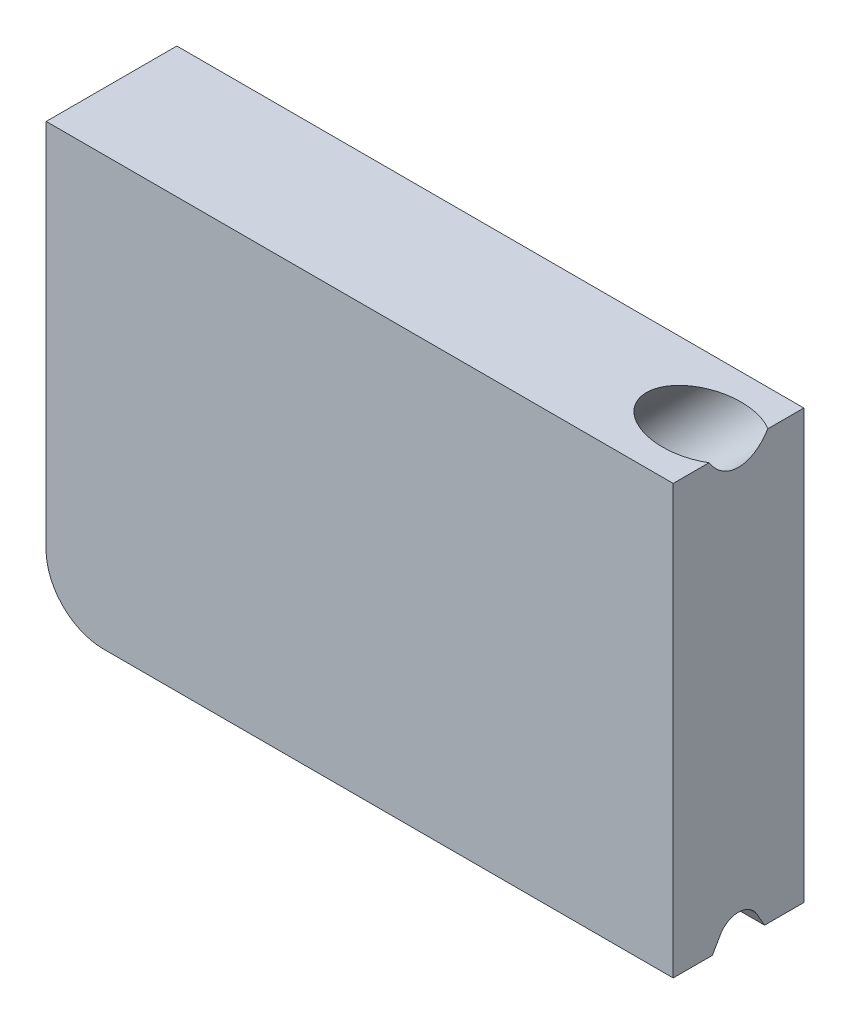
ISO-10303-21;
HEADER;
FILE_DESCRIPTION(('STEP AP214'),'2;1');
FILE_NAME('part.step','',(''),(''),'','','');
FILE_SCHEMA(('AUTOMOTIVE_DESIGN { 1 0 10303 214 1 1 1 1 }'));
ENDSEC;
DATA;
#1=APPLICATION_CONTEXT('core data for automotive mechanical design processes');
#2=APPLICATION_PROTOCOL_DEFINITION('international standard','automotive_design',2000,#1);
#3=PRODUCT_CONTEXT('',#1,'mechanical');
#4=PRODUCT('Part','Part','',(#3));
#5=PRODUCT_RELATED_PRODUCT_CATEGORY('part','',(#4));
#6=PRODUCT_DEFINITION_FORMATION('','',#4);
#7=PRODUCT_DEFINITION_CONTEXT('part definition',#1,'design');
#8=PRODUCT_DEFINITION('design','',#6,#7);
#9=PRODUCT_DEFINITION_SHAPE('','',#8);
#10=(LENGTH_UNIT() NAMED_UNIT(*) SI_UNIT(.MILLI.,.METRE.));
#11=(NAMED_UNIT(*) PLANE_ANGLE_UNIT() SI_UNIT($,.RADIAN.));
#12=(NAMED_UNIT(*) SI_UNIT($,.STERADIAN.) SOLID_ANGLE_UNIT());
#13=UNCERTAINTY_MEASURE_WITH_UNIT(LENGTH_MEASURE(1.E-05),#10,'distance_accuracy_value','');
#14=(GEOMETRIC_REPRESENTATION_CONTEXT(3) GLOBAL_UNCERTAINTY_ASSIGNED_CONTEXT((#13)) GLOBAL_UNIT_ASSIGNED_CONTEXT((#10,
#11,#12)) REPRESENTATION_CONTEXT('',''));
#15=CARTESIAN_POINT('',(0.,0.,0.));
#16=DIRECTION('',(0.,0.,1.));
#17=DIRECTION('',(1.,0.,0.));
#18=AXIS2_PLACEMENT_3D('',#15,#16,#17);
#19=CARTESIAN_POINT('',(37.8727893023531,0.,-0.0635));
#20=DIRECTION('',(0.,0.,-1.));
#21=DIRECTION('',(-1.,0.,0.));
#22=AXIS2_PLACEMENT_3D('',#19,#20,#21);
#23=PLANE('',#22);
#24=DIRECTION('',(0.,-1.,0.));
#25=VECTOR('',#24,1.);
#26=CARTESIAN_POINT('',(-0.37592,29.999999944,-0.0635));
#27=LINE('',#26,#25);
#28=CARTESIAN_POINT('',(-0.37592,0.416450285248574,-0.0635));
#29=VERTEX_POINT('',#28);
#30=CARTESIAN_POINT('',(-0.37592,0.0525118412388941,-0.0635000000000011));
#31=VERTEX_POINT('',#30);
#32=EDGE_CURVE('E55',#29,#31,#27,.T.);
#33=ORIENTED_EDGE('',*,*,#32,.F.);
#34=DIRECTION('',(1.,0.,0.));
#35=VECTOR('',#34,1.);
#36=CARTESIAN_POINT('',(37.8727893023531,0.416450285248574,-0.0635));
#37=LINE('',#36,#35);
#38=CARTESIAN_POINT('',(0.23368,0.416450285248574,-0.0635000000000011));
#39=VERTEX_POINT('',#38);
#40=EDGE_CURVE('E210',#29,#39,#37,.T.);
#41=ORIENTED_EDGE('',*,*,#40,.T.);
#42=DIRECTION('',(0.,-1.,0.));
#43=VECTOR('',#42,1.);
#44=CARTESIAN_POINT('',(0.23368,0.,-0.0635000000000011));
#45=LINE('',#44,#43);
#46=CARTESIAN_POINT('',(0.23368,0.,-0.0635));
#47=VERTEX_POINT('',#46);
#48=EDGE_CURVE('E196',#39,#47,#45,.T.);
#49=ORIENTED_EDGE('',*,*,#48,.T.);
#50=DIRECTION('',(-1.,0.,0.));
#51=VECTOR('',#50,1.);
#52=CARTESIAN_POINT('',(37.8727893023531,0.,-0.0635));
#53=LINE('',#52,#51);
#54=CARTESIAN_POINT('',(-0.3201416,0.,-0.0635000000000011));
#55=VERTEX_POINT('',#54);
#56=EDGE_CURVE('E338',#47,#55,#53,.T.);
#57=ORIENTED_EDGE('',*,*,#56,.T.);
#58=CARTESIAN_POINT('',(-0.3201416,0.05588,-0.0635000000000011));
#59=DIRECTION('',(0.,0.,-1.));
#60=DIRECTION('',(-1.,0.,0.));
#61=AXIS2_PLACEMENT_3D('',#58,#59,#60);
#62=CIRCLE('',#61,0.05588);
#63=EDGE_CURVE('E459',#31,#55,#62,.F.);
#64=ORIENTED_EDGE('',*,*,#63,.F.);
#65=EDGE_LOOP('',(#33,#41,#49,#57,#64));
#66=FACE_BOUND('',#65,.T.);
#67=ADVANCED_FACE('F47',(#66),#23,.T.);
#68=CARTESIAN_POINT('',(37.8727893023531,0.,0.0635));
#69=DIRECTION('',(0.,0.,1.));
#70=DIRECTION('',(1.,0.,0.));
#71=AXIS2_PLACEMENT_3D('',#68,#69,#70);
#72=PLANE('',#71);
#73=DIRECTION('',(0.,1.,0.));
#74=VECTOR('',#73,1.);
#75=CARTESIAN_POINT('',(0.23368,0.,0.0635000000000011));
#76=LINE('',#75,#74);
#77=CARTESIAN_POINT('',(0.23368,0.,0.0635));
#78=VERTEX_POINT('',#77);
#79=CARTESIAN_POINT('',(0.23368,0.416450285248574,0.0635000000000011));
#80=VERTEX_POINT('',#79);
#81=EDGE_CURVE('E330',#78,#80,#76,.T.);
#82=ORIENTED_EDGE('',*,*,#81,.T.);
#83=DIRECTION('',(-1.,0.,0.));
#84=VECTOR('',#83,1.);
#85=CARTESIAN_POINT('',(37.8727893023531,0.416450285248574,0.0635));
#86=LINE('',#85,#84);
#87=CARTESIAN_POINT('',(-0.37592,0.416450285248574,0.0635));
#88=VERTEX_POINT('',#87);
#89=EDGE_CURVE('E76',#80,#88,#86,.T.);
#90=ORIENTED_EDGE('',*,*,#89,.T.);
#91=DIRECTION('',(0.,1.,0.));
#92=VECTOR('',#91,1.);
#93=CARTESIAN_POINT('',(-0.37592,29.999999944,0.0635));
#94=LINE('',#93,#92);
#95=CARTESIAN_POINT('',(-0.37592,0.0525118412388941,0.0635000000000011));
#96=VERTEX_POINT('',#95);
#97=EDGE_CURVE('E332',#96,#88,#94,.T.);
#98=ORIENTED_EDGE('',*,*,#97,.F.);
#99=CARTESIAN_POINT('',(-0.3201416,0.05588,0.0635000000000011));
#100=DIRECTION('',(0.,0.,1.));
#101=DIRECTION('',(1.,0.,0.));
#102=AXIS2_PLACEMENT_3D('',#99,#100,#101);
#103=CIRCLE('',#102,0.05588);
#104=CARTESIAN_POINT('',(-0.3201416,0.,0.0635000000000011));
#105=VERTEX_POINT('',#104);
#106=EDGE_CURVE('E446',#105,#96,#103,.F.);
#107=ORIENTED_EDGE('',*,*,#106,.F.);
#108=DIRECTION('',(-1.,0.,0.));
#109=VECTOR('',#108,1.);
#110=CARTESIAN_POINT('',(37.8727893023531,0.,0.0635));
#111=LINE('',#110,#109);
#112=EDGE_CURVE('E335',#78,#105,#111,.T.);
#113=ORIENTED_EDGE('',*,*,#112,.F.);
#114=EDGE_LOOP('',(#82,#90,#98,#107,#113));
#115=FACE_BOUND('',#114,.T.);
#116=ADVANCED_FACE('F389',(#115),#72,.T.);
#117=CARTESIAN_POINT('',(-0.37592,29.999999944,-0.80247998));
#118=DIRECTION('',(-1.,0.,0.));
#119=DIRECTION('',(0.,0.,1.));
#120=AXIS2_PLACEMENT_3D('',#117,#118,#119);
#121=PLANE('',#120);
#122=ORIENTED_EDGE('',*,*,#97,.T.);
#123=DIRECTION('',(0.,0.,-1.));
#124=VECTOR('',#123,1.);
#125=CARTESIAN_POINT('',(-0.37592,0.416450285248574,-0.80247998));
#126=LINE('',#125,#124);
#127=EDGE_CURVE('E68',#88,#29,#126,.T.);
#128=ORIENTED_EDGE('',*,*,#127,.T.);
#129=ORIENTED_EDGE('',*,*,#32,.T.);
#130=DIRECTION('',(0.,0.,-1.));
#131=VECTOR('',#130,1.);
#132=CARTESIAN_POINT('',(-0.37592,0.0525118412388941,37.6127138980092));
#133=LINE('',#132,#131);
#134=CARTESIAN_POINT('',(-0.37592,0.0525250403824918,-0.0272323203714327));
#135=VERTEX_POINT('',#134);
#136=EDGE_CURVE('E454',#135,#31,#133,.T.);
#137=ORIENTED_EDGE('',*,*,#136,.F.);
#138=CARTESIAN_POINT('',(-0.37592,0.0135140905122495,0.0175976362048998));
#139=CARTESIAN_POINT('',(-0.37592,0.0229198321940677,0.0268164528061493));
#140=CARTESIAN_POINT('',(-0.375919999999999,0.0383728920909442,0.0311593514217872));
#141=CARTESIAN_POINT('',(-0.375920000000001,0.0640224357976938,0.024085648578213));
#142=CARTESIAN_POINT('',(-0.37592,0.0744740905122485,0.0121167298490642));
#143=CARTESIAN_POINT('',(-0.37592,0.0744740905122485,-0.012116729849064));
#144=CARTESIAN_POINT('',(-0.375919999999999,0.0640224357976993,-0.0240856485782128));
#145=CARTESIAN_POINT('',(-0.37592,0.0383728920909457,-0.0311593514217872));
#146=CARTESIAN_POINT('',(-0.37592,0.0229198321940666,-0.0268164528061483));
#147=CARTESIAN_POINT('',(-0.37592,0.0135140905122495,-0.0175976362048998));
#148=(BOUNDED_CURVE() B_SPLINE_CURVE(3,(#138,#139,#140,#141,#142,#143,#144,#145,#146,#147),
.UNSPECIFIED.,.F.,.F.) B_SPLINE_CURVE_WITH_KNOTS((4,2,2,2,4),(3.66519142918809,4.18879020478639,
4.71238898038469,5.23598775598299,5.75958653158129),
.UNSPECIFIED.) CURVE() GEOMETRIC_REPRESENTATION_ITEM() RATIONAL_B_SPLINE_CURVE((1.,1.,1.,1.,1.,
1.,1.,1.,1.,1.)) REPRESENTATION_ITEM(''));
#149=CARTESIAN_POINT('',(-0.375920000000275,0.0525255387834095,0.0272159605744741));
#150=VERTEX_POINT('',#149);
#151=EDGE_CURVE('E420',#135,#150,#148,.F.);
#152=ORIENTED_EDGE('',*,*,#151,.T.);
#153=EDGE_CURVE('E445',#96,#150,#133,.T.);
#154=ORIENTED_EDGE('',*,*,#153,.F.);
#155=EDGE_LOOP('',(#122,#128,#129,#137,#152,#154));
#156=FACE_BOUND('',#155,.T.);
#157=ADVANCED_FACE('F392',(#156),#121,.T.);
#158=CARTESIAN_POINT('',(0.23368,0.,38.4527456938784));
#159=DIRECTION('',(-1.,0.,0.));
#160=DIRECTION('',(0.,0.,1.));
#161=AXIS2_PLACEMENT_3D('',#158,#159,#160);
#162=PLANE('',#161);
#163=DIRECTION('',(0.,0.,-1.));
#164=VECTOR('',#163,1.);
#165=CARTESIAN_POINT('',(0.23368,0.416450285248574,38.4527456938784));
#166=LINE('',#165,#164);
#167=CARTESIAN_POINT('',(0.23368,0.416450285248574,0.0285560103091458));
#168=VERTEX_POINT('',#167);
#169=EDGE_CURVE('E206',#80,#168,#166,.T.);
#170=ORIENTED_EDGE('',*,*,#169,.F.);
#171=ORIENTED_EDGE('',*,*,#81,.F.);
#172=DIRECTION('',(0.,0.,-1.));
#173=VECTOR('',#172,1.);
#174=CARTESIAN_POINT('',(0.23368,0.,38.4527456938784));
#175=LINE('',#174,#173);
#176=CARTESIAN_POINT('',(0.23368,0.,0.0254));
#177=VERTEX_POINT('',#176);
#178=EDGE_CURVE('E348',#78,#177,#175,.T.);
#179=ORIENTED_EDGE('',*,*,#178,.T.);
#180=DIRECTION('',(0.,0.86602540378444,-0.499999999999998));
#181=VECTOR('',#180,1.);
#182=CARTESIAN_POINT('',(0.23368,-16.6395287854526,9.63223642346953));
#183=LINE('',#182,#181);
#184=CARTESIAN_POINT('',(0.23368,0.0135140905122495,0.0175976362048998));
#185=VERTEX_POINT('',#184);
#186=EDGE_CURVE('E287',#177,#185,#183,.T.);
#187=ORIENTED_EDGE('',*,*,#186,.T.);
#188=CARTESIAN_POINT('',(0.23368,0.00335409051224956,0.));
#189=DIRECTION('',(-1.,0.,0.));
#190=DIRECTION('',(0.,0.,1.));
#191=AXIS2_PLACEMENT_3D('',#188,#189,#190);
#192=CIRCLE('',#191,0.02032);
#193=CARTESIAN_POINT('',(0.23368,0.0135140905122495,-0.0175976362048998));
#194=VERTEX_POINT('',#193);
#195=EDGE_CURVE('E282',#185,#194,#192,.T.);
#196=ORIENTED_EDGE('',*,*,#195,.T.);
#197=DIRECTION('',(0.,-0.86602540378444,-0.499999999999998));
#198=VECTOR('',#197,1.);
#199=CARTESIAN_POINT('',(0.23368,16.6615258307087,9.59413642346951));
#200=LINE('',#199,#198);
#201=CARTESIAN_POINT('',(0.23368,0.,-0.0254));
#202=VERTEX_POINT('',#201);
#203=EDGE_CURVE('E279',#194,#202,#200,.T.);
#204=ORIENTED_EDGE('',*,*,#203,.T.);
#205=EDGE_CURVE('E343',#202,#47,#175,.T.);
#206=ORIENTED_EDGE('',*,*,#205,.T.);
#207=ORIENTED_EDGE('',*,*,#48,.F.);
#208=CARTESIAN_POINT('',(0.23368,0.416450285248574,-0.0285560103091458));
#209=VERTEX_POINT('',#208);
#210=EDGE_CURVE('E201',#209,#39,#166,.T.);
#211=ORIENTED_EDGE('',*,*,#210,.F.);
#212=CARTESIAN_POINT('',(0.23368,0.452119999999997,0.));
#213=DIRECTION('',(-1.,0.,0.));
#214=DIRECTION('',(0.,1.,0.));
#215=AXIS2_PLACEMENT_3D('',#212,#213,#214);
#216=ELLIPSE('',#215,0.0538815367264146,0.0381);
#217=EDGE_CURVE('E191',#209,#168,#216,.T.);
#218=ORIENTED_EDGE('',*,*,#217,.T.);
#219=EDGE_LOOP('',(#170,#171,#179,#187,#196,#204,#206,#207,#211,#218));
#220=FACE_BOUND('',#219,.T.);
#221=ADVANCED_FACE('F202',(#220),#162,.F.);
#222=CARTESIAN_POINT('',(-0.310421536726418,-0.0919815367264147,0.));
#223=DIRECTION('',(0.707106781186551,0.707106781186544,0.));
#224=DIRECTION('',(-0.707106781186544,0.707106781186551,0.));
#225=AXIS2_PLACEMENT_3D('',#222,#223,#224);
#226=CYLINDRICAL_SURFACE('',#225,0.0381);
#227=CARTESIAN_POINT('',(-0.0457200000000001,0.17272,0.));
#228=DIRECTION('',(1.,0.,0.));
#229=DIRECTION('',(0.,1.,0.));
#230=AXIS2_PLACEMENT_3D('',#227,#228,#229);
#231=ELLIPSE('',#230,0.0538815367264146,0.0381);
#232=CARTESIAN_POINT('',(-0.0457200000000001,0.17272,-0.0380999999999784));
#233=VERTEX_POINT('',#232);
#234=CARTESIAN_POINT('',(-0.0457200000000001,0.17272,0.0381));
#235=VERTEX_POINT('',#234);
#236=EDGE_CURVE('E293',#233,#235,#231,.F.);
#237=ORIENTED_EDGE('',*,*,#236,.T.);
#238=CARTESIAN_POINT('',(-0.0457200000000001,0.17272,0.));
#239=DIRECTION('',(0.,1.,0.));
#240=DIRECTION('',(1.,0.,0.));
#241=AXIS2_PLACEMENT_3D('',#238,#239,#240);
#242=ELLIPSE('',#241,0.0538815367264152,0.0381);
#243=EDGE_CURVE('E290',#235,#233,#242,.F.);
#244=ORIENTED_EDGE('',*,*,#243,.T.);
#245=EDGE_LOOP('',(#237,#244));
#246=FACE_BOUND('',#245,.T.);
#247=CARTESIAN_POINT('',(0.198010285248576,0.416450285248574,0.));
#248=DIRECTION('',(0.,1.,0.));
#249=DIRECTION('',(1.,0.,0.));
#250=AXIS2_PLACEMENT_3D('',#247,#248,#249);
#251=ELLIPSE('',#250,0.0538815367264152,0.0381);
#252=EDGE_CURVE('E13',#168,#209,#251,.F.);
#253=ORIENTED_EDGE('',*,*,#252,.F.);
#254=ORIENTED_EDGE('',*,*,#217,.F.);
#255=EDGE_LOOP('',(#253,#254));
#256=FACE_BOUND('',#255,.T.);
#257=ADVANCED_FACE('F193',(#246,#256),#226,.F.);
#258=CARTESIAN_POINT('',(-0.375920000000002,0.,0.0254));
#259=DIRECTION('',(0.,0.499999999999998,0.86602540378444));
#260=DIRECTION('',(0.,-0.86602540378444,0.499999999999998));
#261=AXIS2_PLACEMENT_3D('',#258,#259,#260);
#262=PLANE('',#261);
#263=DIRECTION('',(1.,0.,0.));
#264=VECTOR('',#263,1.);
#265=CARTESIAN_POINT('',(-0.375920000000002,0.,0.0254));
#266=LINE('',#265,#264);
#267=CARTESIAN_POINT('',(-0.3201416,0.,0.0254000000000038));
#268=VERTEX_POINT('',#267);
#269=CARTESIAN_POINT('',(-0.24787716848564,0.,0.0254));
#270=VERTEX_POINT('',#269);
#271=EDGE_CURVE('E460',#268,#270,#266,.T.);
#272=ORIENTED_EDGE('',*,*,#271,.F.);
#273=CARTESIAN_POINT('',(-0.3201416,0.05588,-0.00686233304231232));
#274=DIRECTION('',(0.,0.499999999999998,0.86602540378444));
#275=DIRECTION('',(0.,0.86602540378444,-0.499999999999998));
#276=AXIS2_PLACEMENT_3D('',#273,#274,#275);
#277=ELLIPSE('',#276,0.0645246660846325,0.05588);
#278=CARTESIAN_POINT('',(-0.356579274367003,0.0135140905122495,0.0175976362048998));
#279=VERTEX_POINT('',#278);
#280=EDGE_CURVE('E221',#268,#279,#277,.F.);
#281=ORIENTED_EDGE('',*,*,#280,.T.);
#282=DIRECTION('',(1.,0.,0.));
#283=VECTOR('',#282,1.);
#284=CARTESIAN_POINT('',(-0.375920000000002,0.0135140905122495,0.0175976362048998));
#285=LINE('',#284,#283);
#286=CARTESIAN_POINT('',(-0.246303766091823,0.0135140905122495,0.0175976362048998));
#287=VERTEX_POINT('',#286);
#288=EDGE_CURVE('E268',#279,#287,#285,.T.);
#289=ORIENTED_EDGE('',*,*,#288,.T.);
#290=CARTESIAN_POINT('',(-0.18968590948775,0.0439940905122497,0.));
#291=DIRECTION('',(0.,0.499999999999998,0.86602540378444));
#292=DIRECTION('',(-0.554700196225233,-0.720576692122891,0.416025147168919));
#293=AXIS2_PLACEMENT_3D('',#290,#291,#292);
#294=ELLIPSE('',#293,0.0879881810244995,0.0381);
#295=EDGE_CURVE('E286',#270,#287,#294,.F.);
#296=ORIENTED_EDGE('',*,*,#295,.F.);
#297=EDGE_LOOP('',(#272,#281,#289,#296));
#298=FACE_BOUND('',#297,.T.);
#299=ADVANCED_FACE('F482',(#298),#262,.F.);
#300=CARTESIAN_POINT('',(-0.375920000000002,0.0135140905122495,-0.0175976362048998));
#301=DIRECTION('',(0.,0.499999999999998,-0.86602540378444));
#302=DIRECTION('',(0.,0.86602540378444,0.499999999999998));
#303=AXIS2_PLACEMENT_3D('',#300,#301,#302);
#304=PLANE('',#303);
#305=DIRECTION('',(1.,0.,0.));
#306=VECTOR('',#305,1.);
#307=CARTESIAN_POINT('',(-0.375920000000002,0.0135140905122495,-0.0175976362048998));
#308=LINE('',#307,#306);
#309=CARTESIAN_POINT('',(-0.356579274367005,0.0135140905122495,-0.0175976362048998));
#310=VERTEX_POINT('',#309);
#311=CARTESIAN_POINT('',(-0.246303766091823,0.0135140905122495,-0.0175976362048998));
#312=VERTEX_POINT('',#311);
#313=EDGE_CURVE('E263',#310,#312,#308,.T.);
#314=ORIENTED_EDGE('',*,*,#313,.F.);
#315=CARTESIAN_POINT('',(-0.3201416,0.05588,0.00686233304231232));
#316=DIRECTION('',(0.,0.499999999999998,-0.86602540378444));
#317=DIRECTION('',(0.,-0.86602540378444,-0.499999999999998));
#318=AXIS2_PLACEMENT_3D('',#315,#316,#317);
#319=ELLIPSE('',#318,0.0645246660846325,0.05588);
#320=CARTESIAN_POINT('',(-0.3201416,0.,-0.0254000000000038));
#321=VERTEX_POINT('',#320);
#322=EDGE_CURVE('E457',#310,#321,#319,.F.);
#323=ORIENTED_EDGE('',*,*,#322,.T.);
#324=DIRECTION('',(1.,0.,0.));
#325=VECTOR('',#324,1.);
#326=CARTESIAN_POINT('',(-0.375920000000002,0.,-0.0254));
#327=LINE('',#326,#325);
#328=CARTESIAN_POINT('',(-0.24787716848564,0.,-0.0254));
#329=VERTEX_POINT('',#328);
#330=EDGE_CURVE('E274',#321,#329,#327,.T.);
#331=ORIENTED_EDGE('',*,*,#330,.T.);
#332=CARTESIAN_POINT('',(-0.18968590948775,0.0439940905122497,0.));
#333=DIRECTION('',(0.,0.499999999999998,-0.86602540378444));
#334=DIRECTION('',(-0.554700196225232,-0.720576692122891,-0.416025147168919));
#335=AXIS2_PLACEMENT_3D('',#332,#333,#334);
#336=ELLIPSE('',#335,0.0879881810244996,0.0381);
#337=EDGE_CURVE('E283',#312,#329,#336,.F.);
#338=ORIENTED_EDGE('',*,*,#337,.F.);
#339=EDGE_LOOP('',(#314,#323,#331,#338));
#340=FACE_BOUND('',#339,.T.);
#341=ADVANCED_FACE('F476',(#340),#304,.F.);
#342=CARTESIAN_POINT('',(0.,0.,0.));
#343=DIRECTION('',(0.,1.,0.));
#344=DIRECTION('',(0.,0.,1.));
#345=AXIS2_PLACEMENT_3D('',#342,#343,#344);
#346=PLANE('',#345);
#347=ORIENTED_EDGE('',*,*,#112,.T.);
#348=DIRECTION('',(0.,0.,-1.));
#349=VECTOR('',#348,1.);
#350=CARTESIAN_POINT('',(-0.3201416,0.,37.6127138980092));
#351=LINE('',#350,#349);
#352=EDGE_CURVE('E217',#105,#268,#351,.T.);
#353=ORIENTED_EDGE('',*,*,#352,.T.);
#354=ORIENTED_EDGE('',*,*,#271,.T.);
#355=CARTESIAN_POINT('',(-0.21508590948775,0.,0.));
#356=DIRECTION('',(0.,1.,0.));
#357=DIRECTION('',(-1.,0.,0.));
#358=AXIS2_PLACEMENT_3D('',#355,#356,#357);
#359=ELLIPSE('',#358,0.0439940905122496,0.0381);
#360=CARTESIAN_POINT('',(-0.21508590948775,0.,0.0381));
#361=VERTEX_POINT('',#360);
#362=EDGE_CURVE('E197',#361,#270,#359,.F.);
#363=ORIENTED_EDGE('',*,*,#362,.F.);
#364=DIRECTION('',(1.,0.,0.));
#365=VECTOR('',#364,1.);
#366=CARTESIAN_POINT('',(-0.0457200000000001,0.,0.0381));
#367=LINE('',#366,#365);
#368=CARTESIAN_POINT('',(-0.0457200000000001,0.,0.0381));
#369=VERTEX_POINT('',#368);
#370=EDGE_CURVE('E300',#361,#369,#367,.T.);
#371=ORIENTED_EDGE('',*,*,#370,.T.);
#372=DIRECTION('',(0.,0.,-1.));
#373=VECTOR('',#372,1.);
#374=CARTESIAN_POINT('',(-0.0457200000000001,0.,0.0381));
#375=LINE('',#374,#373);
#376=CARTESIAN_POINT('',(-0.0457200000000001,0.,0.0254));
#377=VERTEX_POINT('',#376);
#378=EDGE_CURVE('E315',#369,#377,#375,.T.);
#379=ORIENTED_EDGE('',*,*,#378,.T.);
#380=EDGE_CURVE('E461',#377,#177,#266,.T.);
#381=ORIENTED_EDGE('',*,*,#380,.T.);
#382=ORIENTED_EDGE('',*,*,#178,.F.);
#383=EDGE_LOOP('',(#347,#353,#354,#363,#371,#379,#381,#382));
#384=FACE_BOUND('',#383,.T.);
#385=ADVANCED_FACE('F474',(#384),#346,.F.);
#386=ORIENTED_EDGE('',*,*,#330,.F.);
#387=EDGE_CURVE('E215',#321,#55,#351,.T.);
#388=ORIENTED_EDGE('',*,*,#387,.T.);
#389=ORIENTED_EDGE('',*,*,#56,.F.);
#390=ORIENTED_EDGE('',*,*,#205,.F.);
#391=CARTESIAN_POINT('',(-0.0457200000000001,0.,-0.0254));
#392=VERTEX_POINT('',#391);
#393=EDGE_CURVE('E278',#392,#202,#327,.T.);
#394=ORIENTED_EDGE('',*,*,#393,.F.);
#395=CARTESIAN_POINT('',(-0.0457200000000001,0.,-0.0381));
#396=VERTEX_POINT('',#395);
#397=EDGE_CURVE('E307',#392,#396,#375,.T.);
#398=ORIENTED_EDGE('',*,*,#397,.T.);
#399=DIRECTION('',(1.,0.,0.));
#400=VECTOR('',#399,1.);
#401=CARTESIAN_POINT('',(-0.0457200000000001,0.,-0.0381));
#402=LINE('',#401,#400);
#403=CARTESIAN_POINT('',(-0.21508590948775,0.,-0.0381));
#404=VERTEX_POINT('',#403);
#405=EDGE_CURVE('E310',#404,#396,#402,.T.);
#406=ORIENTED_EDGE('',*,*,#405,.F.);
#407=EDGE_CURVE('E325',#329,#404,#359,.F.);
#408=ORIENTED_EDGE('',*,*,#407,.F.);
#409=EDGE_LOOP('',(#386,#388,#389,#390,#394,#398,#406,#408));
#410=FACE_BOUND('',#409,.T.);
#411=ADVANCED_FACE('F387',(#410),#346,.F.);
#412=CARTESIAN_POINT('',(-0.115365970993317,0.17272,0.));
#413=DIRECTION('',(-0.500000000000004,-0.866025403784436,0.));
#414=DIRECTION('',(0.866025403784436,-0.500000000000004,0.));
#415=AXIS2_PLACEMENT_3D('',#412,#413,#414);
#416=CYLINDRICAL_SURFACE('',#415,0.0381);
#417=ORIENTED_EDGE('',*,*,#295,.T.);
#418=CARTESIAN_POINT('',(-0.246303766091824,0.013514090512244,-0.017597636204903));
#419=CARTESIAN_POINT('',(-0.242045036696595,0.0181696216963577,-0.020209998198343));
#420=CARTESIAN_POINT('',(-0.238342792283757,0.0274686849987219,-0.0178473317228446));
#421=CARTESIAN_POINT('',(-0.232817108218903,0.042757767572229,-0.0108001028233127));
#422=CARTESIAN_POINT('',(-0.230744577137303,0.0490777321936908,-0.00536388628665731));
#423=CARTESIAN_POINT('',(-0.230749544148545,0.0490704485063341,0.00535919824893009));
#424=CARTESIAN_POINT('',(-0.232820826594818,0.0427349721347567,0.0108281496370145));
#425=CARTESIAN_POINT('',(-0.2383422824676,0.0274410137649406,0.0178745687691085));
#426=CARTESIAN_POINT('',(-0.242057611757422,0.018157429976937,0.0202007914571856));
#427=CARTESIAN_POINT('',(-0.246303766091823,0.0135140905122495,0.0175976362048998));
#428=(BOUNDED_CURVE() B_SPLINE_CURVE(3,(#418,#419,#420,#421,#422,#423,#424,#425,#426,#427),
.UNSPECIFIED.,.F.,.F.) B_SPLINE_CURVE_WITH_KNOTS((4,2,2,2,4),(0.,1.06094724683244E-05,
2.12189449366489E-05,3.18284174049733E-05,4.24378898732978E-05),
.UNSPECIFIED.) CURVE() GEOMETRIC_REPRESENTATION_ITEM() RATIONAL_B_SPLINE_CURVE((1.,1.,1.,1.,1.,
1.,1.,1.,1.,1.)) REPRESENTATION_ITEM(''));
#429=EDGE_CURVE('E359',#287,#312,#428,.F.);
#430=ORIENTED_EDGE('',*,*,#429,.T.);
#431=ORIENTED_EDGE('',*,*,#337,.T.);
#432=ORIENTED_EDGE('',*,*,#407,.T.);
#433=DIRECTION('',(0.500000000000004,0.866025403784436,0.));
#434=VECTOR('',#433,1.);
#435=CARTESIAN_POINT('',(-0.115365970993317,0.17272,-0.0381));
#436=LINE('',#435,#434);
#437=CARTESIAN_POINT('',(-0.115365970993317,0.17272,-0.0381));
#438=VERTEX_POINT('',#437);
#439=EDGE_CURVE('E320',#404,#438,#436,.T.);
#440=ORIENTED_EDGE('',*,*,#439,.T.);
#441=CARTESIAN_POINT('',(-0.115365970993317,0.17272,0.));
#442=DIRECTION('',(0.,-1.,0.));
#443=DIRECTION('',(-1.,0.,0.));
#444=AXIS2_PLACEMENT_3D('',#441,#442,#443);
#445=ELLIPSE('',#444,0.0439940905122496,0.0381);
#446=CARTESIAN_POINT('',(-0.115365970993317,0.17272,0.0381));
#447=VERTEX_POINT('',#446);
#448=EDGE_CURVE('E323',#438,#447,#445,.F.);
#449=ORIENTED_EDGE('',*,*,#448,.T.);
#450=DIRECTION('',(-0.500000000000004,-0.866025403784436,0.));
#451=VECTOR('',#450,1.);
#452=CARTESIAN_POINT('',(-0.161314432115812,0.0931349308062367,0.0381));
#453=LINE('',#452,#451);
#454=EDGE_CURVE('E318',#447,#361,#453,.T.);
#455=ORIENTED_EDGE('',*,*,#454,.T.);
#456=ORIENTED_EDGE('',*,*,#362,.T.);
#457=EDGE_LOOP('',(#417,#430,#431,#432,#440,#449,#455,#456));
#458=FACE_BOUND('',#457,.T.);
#459=ADVANCED_FACE('F373',(#458),#416,.F.);
#460=CARTESIAN_POINT('',(-0.159360061505567,0.17272,0.0381));
#461=DIRECTION('',(0.,-1.,0.));
#462=DIRECTION('',(0.,0.,-1.));
#463=AXIS2_PLACEMENT_3D('',#460,#461,#462);
#464=PLANE('',#463);
#465=DIRECTION('',(-1.,0.,0.));
#466=VECTOR('',#465,1.);
#467=CARTESIAN_POINT('',(-0.159360061505567,0.17272,-0.0381));
#468=LINE('',#467,#466);
#469=EDGE_CURVE('E296',#233,#438,#468,.T.);
#470=ORIENTED_EDGE('',*,*,#469,.F.);
#471=ORIENTED_EDGE('',*,*,#243,.F.);
#472=DIRECTION('',(-1.,0.,0.));
#473=VECTOR('',#472,1.);
#474=CARTESIAN_POINT('',(-0.159360061505567,0.17272,0.0381));
#475=LINE('',#474,#473);
#476=EDGE_CURVE('E297',#235,#447,#475,.T.);
#477=ORIENTED_EDGE('',*,*,#476,.T.);
#478=ORIENTED_EDGE('',*,*,#448,.F.);
#479=EDGE_LOOP('',(#470,#471,#477,#478));
#480=FACE_BOUND('',#479,.T.);
#481=ADVANCED_FACE('F386',(#480),#464,.T.);
#482=CARTESIAN_POINT('',(-0.0457200000000001,0.17272,0.0381));
#483=DIRECTION('',(-1.,0.,0.));
#484=DIRECTION('',(0.,0.,1.));
#485=AXIS2_PLACEMENT_3D('',#482,#483,#484);
#486=PLANE('',#485);
#487=DIRECTION('',(0.,0.86602540378444,-0.499999999999998));
#488=VECTOR('',#487,1.);
#489=CARTESIAN_POINT('',(-0.0457200000000001,0.124040738685969,-0.046214953870824));
#490=LINE('',#489,#488);
#491=CARTESIAN_POINT('',(-0.0457200000000001,0.0135140905122495,0.0175976362048998));
#492=VERTEX_POINT('',#491);
#493=EDGE_CURVE('E357',#377,#492,#490,.T.);
#494=ORIENTED_EDGE('',*,*,#493,.F.);
#495=ORIENTED_EDGE('',*,*,#378,.F.);
#496=DIRECTION('',(0.,1.,0.));
#497=VECTOR('',#496,1.);
#498=CARTESIAN_POINT('',(-0.0457200000000001,0.17272,0.0381));
#499=LINE('',#498,#497);
#500=EDGE_CURVE('E304',#369,#235,#499,.T.);
#501=ORIENTED_EDGE('',*,*,#500,.T.);
#502=ORIENTED_EDGE('',*,*,#236,.F.);
#503=DIRECTION('',(0.,1.,0.));
#504=VECTOR('',#503,1.);
#505=CARTESIAN_POINT('',(-0.0457200000000001,0.17272,-0.0381));
#506=LINE('',#505,#504);
#507=EDGE_CURVE('E301',#396,#233,#506,.T.);
#508=ORIENTED_EDGE('',*,*,#507,.F.);
#509=ORIENTED_EDGE('',*,*,#397,.F.);
#510=DIRECTION('',(0.,-0.86602540378444,-0.499999999999998));
#511=VECTOR('',#510,1.);
#512=CARTESIAN_POINT('',(-0.0457200000000001,0.157036306570156,0.0652649538708238));
#513=LINE('',#512,#511);
#514=CARTESIAN_POINT('',(-0.0457200000000001,0.0135140905122495,-0.0175976362048998));
#515=VERTEX_POINT('',#514);
#516=EDGE_CURVE('E351',#515,#392,#513,.T.);
#517=ORIENTED_EDGE('',*,*,#516,.F.);
#518=CARTESIAN_POINT('',(-0.0457200000000001,0.00335409051224956,0.));
#519=DIRECTION('',(-1.,0.,0.));
#520=DIRECTION('',(0.,0.,1.));
#521=AXIS2_PLACEMENT_3D('',#518,#519,#520);
#522=CIRCLE('',#521,0.02032);
#523=EDGE_CURVE('E354',#492,#515,#522,.T.);
#524=ORIENTED_EDGE('',*,*,#523,.F.);
#525=EDGE_LOOP('',(#494,#495,#501,#502,#508,#509,#517,#524));
#526=FACE_BOUND('',#525,.T.);
#527=ADVANCED_FACE('F504',(#526),#486,.T.);
#528=CARTESIAN_POINT('',(0.,0.,0.0381));
#529=DIRECTION('',(0.,0.,-1.));
#530=DIRECTION('',(-1.,0.,0.));
#531=AXIS2_PLACEMENT_3D('',#528,#529,#530);
#532=PLANE('',#531);
#533=ORIENTED_EDGE('',*,*,#476,.F.);
#534=ORIENTED_EDGE('',*,*,#500,.F.);
#535=ORIENTED_EDGE('',*,*,#370,.F.);
#536=ORIENTED_EDGE('',*,*,#454,.F.);
#537=EDGE_LOOP('',(#533,#534,#535,#536));
#538=FACE_BOUND('',#537,.T.);
#539=ADVANCED_FACE('F497',(#538),#532,.T.);
#540=CARTESIAN_POINT('',(0.,0.,-0.0381));
#541=DIRECTION('',(0.,0.,-1.));
#542=DIRECTION('',(-1.,0.,0.));
#543=AXIS2_PLACEMENT_3D('',#540,#541,#542);
#544=PLANE('',#543);
#545=ORIENTED_EDGE('',*,*,#405,.T.);
#546=ORIENTED_EDGE('',*,*,#507,.T.);
#547=ORIENTED_EDGE('',*,*,#469,.T.);
#548=ORIENTED_EDGE('',*,*,#439,.F.);
#549=EDGE_LOOP('',(#545,#546,#547,#548));
#550=FACE_BOUND('',#549,.T.);
#551=ADVANCED_FACE('F491',(#550),#544,.F.);
#552=EDGE_CURVE('E267',#515,#194,#308,.T.);
#553=ORIENTED_EDGE('',*,*,#552,.F.);
#554=ORIENTED_EDGE('',*,*,#516,.T.);
#555=ORIENTED_EDGE('',*,*,#393,.T.);
#556=ORIENTED_EDGE('',*,*,#203,.F.);
#557=EDGE_LOOP('',(#553,#554,#555,#556));
#558=FACE_BOUND('',#557,.T.);
#559=ADVANCED_FACE('F484',(#558),#304,.F.);
#560=CARTESIAN_POINT('',(-0.375920000000002,0.00335409051224956,0.));
#561=DIRECTION('',(1.,0.,0.));
#562=DIRECTION('',(0.,0.,-1.));
#563=AXIS2_PLACEMENT_3D('',#560,#561,#562);
#564=CYLINDRICAL_SURFACE('',#563,0.02032);
#565=EDGE_CURVE('E266',#492,#185,#285,.T.);
#566=ORIENTED_EDGE('',*,*,#565,.F.);
#567=ORIENTED_EDGE('',*,*,#523,.T.);
#568=ORIENTED_EDGE('',*,*,#552,.T.);
#569=ORIENTED_EDGE('',*,*,#195,.F.);
#570=EDGE_LOOP('',(#566,#567,#568,#569));
#571=FACE_BOUND('',#570,.T.);
#572=ADVANCED_FACE('F232',(#571),#564,.F.);
#573=ORIENTED_EDGE('',*,*,#380,.F.);
#574=ORIENTED_EDGE('',*,*,#493,.T.);
#575=ORIENTED_EDGE('',*,*,#565,.T.);
#576=ORIENTED_EDGE('',*,*,#186,.F.);
#577=EDGE_LOOP('',(#573,#574,#575,#576));
#578=FACE_BOUND('',#577,.T.);
#579=ADVANCED_FACE('F242',(#578),#262,.F.);
#580=ORIENTED_EDGE('',*,*,#288,.F.);
#581=CARTESIAN_POINT('',(-0.356579274367003,0.0135140905122495,0.0175976362048998));
#582=CARTESIAN_POINT('',(-0.357478504480429,0.014285183702578,0.0171534341812295));
#583=CARTESIAN_POINT('',(-0.358332556798375,0.0150716844925736,0.0166307240525673));
#584=CARTESIAN_POINT('',(-0.359932958951498,0.0166317386558358,0.0154137360035441));
#585=CARTESIAN_POINT('',(-0.360678685501932,0.0174051960873458,0.0147185230734212));
#586=CARTESIAN_POINT('',(-0.361921765258227,0.0187625401140965,0.0132774879923897));
#587=CARTESIAN_POINT('',(-0.362439799406546,0.019356549911165,0.0125593583458686));
#588=CARTESIAN_POINT('',(-0.363370264201059,0.0204628270686732,0.0110045616330549));
#589=CARTESIAN_POINT('',(-0.363782968248266,0.0209753047275703,0.0101682103922115));
#590=CARTESIAN_POINT('',(-0.364499027656335,0.0218897784461368,0.00838679036111317));
#591=CARTESIAN_POINT('',(-0.364801736661285,0.0222911182577069,0.00744112066223242));
#592=CARTESIAN_POINT('',(-0.365290539094006,0.0229510080003233,0.00547184429455362));
#593=CARTESIAN_POINT('',(-0.36547657511811,0.0232094876360648,0.0044481995389718));
#594=CARTESIAN_POINT('',(-0.365718616357075,0.0235481441498642,0.00245544642240651));
#595=CARTESIAN_POINT('',(-0.365785010143287,0.0236425375819324,0.00148998532537644));
#596=CARTESIAN_POINT('',(-0.365820077016404,0.0236922303543137,-0.000445937022448597));
#597=CARTESIAN_POINT('',(-0.365788800090857,0.0236476008461357,-0.00141639546179497));
#598=CARTESIAN_POINT('',(-0.365631448146696,0.0234259544927587,-0.00330029743864323));
#599=CARTESIAN_POINT('',(-0.365508633139834,0.0232534914153485,-0.00421455756607615));
#600=CARTESIAN_POINT('',(-0.365172595866995,0.0227912595553173,-0.00599543091968615));
#601=CARTESIAN_POINT('',(-0.364959371125423,0.0225014875605601,-0.00686204284042871));
#602=CARTESIAN_POINT('',(-0.364439729300942,0.0218148032561502,-0.00854055190001648));
#603=CARTESIAN_POINT('',(-0.364131760539243,0.0214161204474461,-0.0093512398784336));
#604=CARTESIAN_POINT('',(-0.363427825925753,0.0205360721958222,-0.0108841065506175));
#605=CARTESIAN_POINT('',(-0.363031859371885,0.0200547060932323,-0.0116062845381483));
#606=CARTESIAN_POINT('',(-0.362125572479575,0.0189958389776661,-0.0130023513458808));
#607=CARTESIAN_POINT('',(-0.361608971132423,0.0184138656995733,-0.0136687478134871));
#608=CARTESIAN_POINT('',(-0.360490660494098,0.0172122449623864,-0.0148858131893031));
#609=CARTESIAN_POINT('',(-0.359888865509873,0.0165925599327191,-0.0154363641693704));
#610=CARTESIAN_POINT('',(-0.358418467513412,0.0151510589954558,-0.0165776295404003));
#611=CARTESIAN_POINT('',(-0.357524183341061,0.014324732902486,-0.0171302343644677));
#612=CARTESIAN_POINT('',(-0.356579274367761,0.0135140905123155,-0.0175976362059797));
#613=B_SPLINE_CURVE_WITH_KNOTS('',3,(#581,#582,#583,#584,#585,#586,#587,#588,#589,#590,#591,
#592,#593,#594,#595,#596,#597,#598,#599,#600,#601,#602,#603,#604,#605,#606,#607,#608,#609,#610,
#611,#612),.UNSPECIFIED.,.F.,.F.,(4,2,2,2,2,2,2,2,2,2,2,2,2,2,2,4),(0.,0.00379999899087672,
0.00762106297348019,0.010806011876462,0.0139826076747904,0.0171775790252757,0.0203741210863205,
0.0232765697391288,0.026177533171838,0.0289798422844726,0.0317822281347288,0.0346332019685613,
0.0374841985493062,0.0405455123891614,0.0436099276612734,0.0476000736904559),.UNSPECIFIED.);
#614=CARTESIAN_POINT('',(-0.360344374688485,0.017068357838404,0.0149872741180852));
#615=VERTEX_POINT('',#614);
#616=EDGE_CURVE('E218',#279,#615,#613,.T.);
#617=ORIENTED_EDGE('',*,*,#616,.T.);
#618=CARTESIAN_POINT('',(-0.37592,0.0135140905122495,-0.0175976362048998));
#619=CARTESIAN_POINT('',(-0.363279667392166,0.0165689954148222,-0.0158338860370508));
#620=CARTESIAN_POINT('',(-0.350435856546557,0.0191849070941416,-0.0132202213548591));
#621=CARTESIAN_POINT('',(-0.331554143453443,0.0227185463401571,-0.00709977864514087));
#622=CARTESIAN_POINT('',(-0.32512,0.0236740905122496,-0.00353363924601548));
#623=CARTESIAN_POINT('',(-0.32512,0.0236740905122495,0.00353363924601554));
#624=CARTESIAN_POINT('',(-0.331554143453443,0.0227185463401571,0.00709977864514093));
#625=CARTESIAN_POINT('',(-0.350435856546557,0.0191849070941415,0.0132202213548592));
#626=CARTESIAN_POINT('',(-0.363279667392166,0.0165689954148223,0.0158338860370507));
#627=CARTESIAN_POINT('',(-0.37592,0.0135140905122495,0.0175976362048998));
#628=(BOUNDED_CURVE() B_SPLINE_CURVE(3,(#618,#619,#620,#621,#622,#623,#624,#625,#626,#627),
.UNSPECIFIED.,.F.,.F.) B_SPLINE_CURVE_WITH_KNOTS((4,2,2,2,4),(3.66519142918809,4.18879020478639,
4.71238898038469,5.23598775598299,5.75958653158129),
.UNSPECIFIED.) CURVE() GEOMETRIC_REPRESENTATION_ITEM() RATIONAL_B_SPLINE_CURVE((1.,1.,1.,1.,1.,
1.,1.,1.,1.,1.)) REPRESENTATION_ITEM(''));
#629=CARTESIAN_POINT('',(-0.360344097053843,0.0170684051805327,-0.0149872307332296));
#630=VERTEX_POINT('',#629);
#631=EDGE_CURVE('E435',#615,#630,#628,.F.);
#632=ORIENTED_EDGE('',*,*,#631,.T.);
#633=EDGE_CURVE('E447',#630,#310,#613,.T.);
#634=ORIENTED_EDGE('',*,*,#633,.T.);
#635=ORIENTED_EDGE('',*,*,#313,.T.);
#636=CARTESIAN_POINT('',(-0.246303766091823,0.0135140905122495,0.0175976362048998));
#637=CARTESIAN_POINT('',(-0.251220526564665,0.0172330462864338,0.0154504960875702));
#638=CARTESIAN_POINT('',(-0.257730159168603,0.0192867366485835,0.0130601328000389));
#639=CARTESIAN_POINT('',(-0.269469296638129,0.0226657314521176,0.00717473385359345));
#640=CARTESIAN_POINT('',(-0.274739013112601,0.0236743664688822,0.00358756782806606));
#641=CARTESIAN_POINT('',(-0.274743289031226,0.0236738144354414,-0.00359069318655089));
#642=CARTESIAN_POINT('',(-0.269477027163949,0.0226730883590808,-0.00715436366023531));
#643=CARTESIAN_POINT('',(-0.257737047210616,0.0193017273998146,-0.0130415288555882));
#644=CARTESIAN_POINT('',(-0.251229908004471,0.0172410255657333,-0.0154458892485203));
#645=CARTESIAN_POINT('',(-0.246303766091824,0.013514090512244,-0.017597636204903));
#646=(BOUNDED_CURVE() B_SPLINE_CURVE(3,(#636,#637,#638,#639,#640,#641,#642,#643,#644,#645),
.UNSPECIFIED.,.F.,.F.) B_SPLINE_CURVE_WITH_KNOTS((4,2,2,2,4),(0.,1.06094724683244E-05,
2.12189449366489E-05,3.18284174049733E-05,4.24378898732978E-05),
.UNSPECIFIED.) CURVE() GEOMETRIC_REPRESENTATION_ITEM() RATIONAL_B_SPLINE_CURVE((1.,1.,1.,1.,1.,
1.,1.,1.,1.,1.)) REPRESENTATION_ITEM(''));
#647=EDGE_CURVE('E517',#312,#287,#646,.F.);
#648=ORIENTED_EDGE('',*,*,#647,.T.);
#649=EDGE_LOOP('',(#580,#617,#632,#634,#635,#648));
#650=FACE_BOUND('',#649,.T.);
#651=ADVANCED_FACE('F441',(#650),#564,.F.);
#652=CARTESIAN_POINT('',(-0.246303766091823,0.0135140905122495,0.0175976362048998));
#653=CARTESIAN_POINT('',(-0.242057611757422,0.018157429976937,0.0202007914571856));
#654=CARTESIAN_POINT('',(-0.2383422824676,0.0274410137649406,0.0178745687691085));
#655=CARTESIAN_POINT('',(-0.232820826594818,0.0427349721347567,0.0108281496370145));
#656=CARTESIAN_POINT('',(-0.230749544148545,0.0490704485063341,0.00535919824893009));
#657=CARTESIAN_POINT('',(-0.230744577137303,0.0490777321936908,-0.00536388628665731));
#658=CARTESIAN_POINT('',(-0.232817108218903,0.042757767572229,-0.0108001028233127));
#659=CARTESIAN_POINT('',(-0.238342792283757,0.0274686849987219,-0.0178473317228446));
#660=CARTESIAN_POINT('',(-0.242045036696595,0.0181696216963577,-0.020209998198343));
#661=CARTESIAN_POINT('',(-0.246303766091824,0.013514090512244,-0.017597636204903));
#662=CARTESIAN_POINT('',(-0.246303766091823,0.0135140905122495,0.0175976362048998));
#663=CARTESIAN_POINT('',(-0.245681456205048,0.0163330063940778,0.0159866123992807));
#664=CARTESIAN_POINT('',(-0.246042050049669,0.0202743081618353,0.0119608255544953));
#665=CARTESIAN_POINT('',(-0.245895217661059,0.0238298758216232,0.00450864160257037));
#666=CARTESIAN_POINT('',(-0.245412536161422,0.0236739159988605,0.00192349995163735));
#667=CARTESIAN_POINT('',(-0.245410978798018,0.0236742650336919,-0.00192515143074186));
#668=CARTESIAN_POINT('',(-0.24589328407748,0.0238373546546367,-0.00448936383816926));
#669=CARTESIAN_POINT('',(-0.246039858436537,0.0202844054014042,-0.0119400309578241));
#670=CARTESIAN_POINT('',(-0.245674555947342,0.0163627965810348,-0.0159708175303782));
#671=CARTESIAN_POINT('',(-0.246303766091824,0.013514090512244,-0.017597636204903));
#672=CARTESIAN_POINT('',(-0.246303766091823,0.0135140905122495,0.0175976362048998));
#673=CARTESIAN_POINT('',(-0.251220526564665,0.0172330462864338,0.0154504960875702));
#674=CARTESIAN_POINT('',(-0.257730159168603,0.0192867366485835,0.0130601328000389));
#675=CARTESIAN_POINT('',(-0.269469296638129,0.0226657314521176,0.00717473385359345));
#676=CARTESIAN_POINT('',(-0.274739013112601,0.0236743664688822,0.00358756782806606));
#677=CARTESIAN_POINT('',(-0.274743289031226,0.0236738144354414,-0.00359069318655089));
#678=CARTESIAN_POINT('',(-0.269477027163949,0.0226730883590808,-0.00715436366023531));
#679=CARTESIAN_POINT('',(-0.257737047210616,0.0193017273998146,-0.0130415288555882));
#680=CARTESIAN_POINT('',(-0.251229908004471,0.0172410255657333,-0.0154458892485203));
#681=CARTESIAN_POINT('',(-0.246303766091824,0.013514090512244,-0.017597636204903));
#682=(BOUNDED_SURFACE() B_SPLINE_SURFACE(2,3,((#652,#653,#654,#655,#656,#657,#658,#659,#660,
#661),(#662,#663,#664,#665,#666,#667,#668,#669,#670,#671),(#672,#673,#674,#675,#676,#677,#678,
#679,#680,#681)),.UNSPECIFIED.,.F.,.F.,.F.) B_SPLINE_SURFACE_WITH_KNOTS((3,3),(4,2,2,2,4),(0.,
1.),(0.,1.06094724683244E-05,2.12189449366489E-05,3.18284174049733E-05,4.24378898732978E-05),
.UNSPECIFIED.) GEOMETRIC_REPRESENTATION_ITEM() RATIONAL_B_SPLINE_SURFACE(((1.,1.,1.,1.,1.,1.,1.,
1.,1.,1.),(0.900481976016409,0.920512086878839,0.9038884570096,0.87893333091652,
0.866045386235157,0.866005422665391,0.878841919047639,0.90378958685689,0.920443255146826,
0.900481976016413),(1.,1.,1.,1.,1.,1.,1.,1.,1.,1.))) REPRESENTATION_ITEM('') SURFACE());
#683=ORIENTED_EDGE('',*,*,#429,.F.);
#684=ORIENTED_EDGE('',*,*,#647,.F.);
#685=EDGE_LOOP('',(#683,#684));
#686=FACE_BOUND('',#685,.T.);
#687=ADVANCED_FACE('F520',(#686),#682,.T.);
#688=CARTESIAN_POINT('',(-0.37592,0.0135140905122495,-0.0175976362048998));
#689=CARTESIAN_POINT('',(-0.37592,0.0229198321940666,-0.0268164528061483));
#690=CARTESIAN_POINT('',(-0.37592,0.0383728920909457,-0.0311593514217872));
#691=CARTESIAN_POINT('',(-0.375919999999999,0.0640224357976993,-0.0240856485782128));
#692=CARTESIAN_POINT('',(-0.37592,0.0744740905122485,-0.012116729849064));
#693=CARTESIAN_POINT('',(-0.37592,0.0744740905122485,0.0121167298490642));
#694=CARTESIAN_POINT('',(-0.375920000000001,0.0640224357976938,0.024085648578213));
#695=CARTESIAN_POINT('',(-0.375919999999999,0.0383728920909442,0.0311593514217872));
#696=CARTESIAN_POINT('',(-0.37592,0.0229198321940677,0.0268164528061493));
#697=CARTESIAN_POINT('',(-0.37592,0.0135140905122495,0.0175976362048998));
#698=CARTESIAN_POINT('',(-0.37592,0.0135140905122495,-0.0175976362048998));
#699=CARTESIAN_POINT('',(-0.375920000000006,0.0165798931178122,-0.0158274725892162));
#700=CARTESIAN_POINT('',(-0.37592,0.0191849070941418,-0.0132202213548589));
#701=CARTESIAN_POINT('',(-0.375920000000002,0.0227185463401577,-0.00709977864513976));
#702=CARTESIAN_POINT('',(-0.375919999999999,0.0236740905122496,-0.00353363924601559));
#703=CARTESIAN_POINT('',(-0.375919999999999,0.0236740905122496,0.00353363924601564));
#704=CARTESIAN_POINT('',(-0.375919999999998,0.0227185463401566,0.00709977864514197));
#705=CARTESIAN_POINT('',(-0.375919999999999,0.0191849070941412,0.0132202213548596));
#706=CARTESIAN_POINT('',(-0.375920000000005,0.0165798931178133,0.0158274725892155));
#707=CARTESIAN_POINT('',(-0.37592,0.0135140905122495,0.0175976362048998));
#708=CARTESIAN_POINT('',(-0.37592,0.0135140905122495,-0.0175976362048998));
#709=CARTESIAN_POINT('',(-0.363279667392166,0.0165689954148222,-0.0158338860370508));
#710=CARTESIAN_POINT('',(-0.350435856546557,0.0191849070941416,-0.0132202213548591));
#711=CARTESIAN_POINT('',(-0.331554143453443,0.0227185463401571,-0.00709977864514087));
#712=CARTESIAN_POINT('',(-0.32512,0.0236740905122496,-0.00353363924601548));
#713=CARTESIAN_POINT('',(-0.32512,0.0236740905122495,0.00353363924601554));
#714=CARTESIAN_POINT('',(-0.331554143453443,0.0227185463401571,0.00709977864514093));
#715=CARTESIAN_POINT('',(-0.350435856546557,0.0191849070941415,0.0132202213548592));
#716=CARTESIAN_POINT('',(-0.363279667392166,0.0165689954148223,0.0158338860370507));
#717=CARTESIAN_POINT('',(-0.37592,0.0135140905122495,0.0175976362048998));
#718=(BOUNDED_SURFACE() B_SPLINE_SURFACE(2,3,((#688,#689,#690,#691,#692,#693,#694,#695,#696,
#697),(#698,#699,#700,#701,#702,#703,#704,#705,#706,#707),(#708,#709,#710,#711,#712,#713,#714,
#715,#716,#717)),.UNSPECIFIED.,.F.,.F.,.F.) B_SPLINE_SURFACE_WITH_KNOTS((3,3),(4,2,2,2,4),(0.,
1.),(3.66519142918809,4.18879020478639,4.71238898038469,5.23598775598299,5.75958653158129),
.UNSPECIFIED.) GEOMETRIC_REPRESENTATION_ITEM() RATIONAL_B_SPLINE_SURFACE(((1.,1.,1.,1.,1.,1.,1.,
1.,1.,1.),(0.707106781186548,0.707106781186548,0.707106781186534,0.707106781186534,
0.707106781186555,0.707106781186555,0.707106781186562,0.707106781186562,0.707106781186548,
0.707106781186548),(1.,1.,1.,1.,1.,1.,1.,1.,1.,1.))) REPRESENTATION_ITEM('') SURFACE());
#719=CARTESIAN_POINT('',(-0.360336874624647,0.017061005965517,-0.0149917538614034));
#720=CARTESIAN_POINT('',(-0.360527400706955,0.0172579427209409,-0.0148358060124896));
#721=CARTESIAN_POINT('',(-0.360727957286525,0.0174688128447198,-0.0147493135574171));
#722=CARTESIAN_POINT('',(-0.361131626226126,0.0179001428536503,-0.0146601363054073));
#723=CARTESIAN_POINT('',(-0.36133458732894,0.0181202930879872,-0.0146556639870128));
#724=CARTESIAN_POINT('',(-0.362115768853044,0.0189813928266083,-0.0146904093112932));
#725=CARTESIAN_POINT('',(-0.362673541786773,0.0196263304700771,-0.0148288978829634));
#726=CARTESIAN_POINT('',(-0.363764697054709,0.0209465423250624,-0.0151688744024613));
#727=CARTESIAN_POINT('',(-0.364297078519904,0.021622169906258,-0.0153718958821203));
#728=CARTESIAN_POINT('',(-0.365745046724987,0.0235486177280002,-0.0159854629573094));
#729=CARTESIAN_POINT('',(-0.366619548045125,0.024819693725826,-0.0164303456308582));
#730=CARTESIAN_POINT('',(-0.368247601166693,0.0274073359938805,-0.0173428366495626));
#731=CARTESIAN_POINT('',(-0.369002336431537,0.0287232774913703,-0.0178101542231249));
#732=CARTESIAN_POINT('',(-0.371122623524928,0.0327935736453075,-0.0192441545498054));
#733=CARTESIAN_POINT('',(-0.372316500910235,0.0356332539873531,-0.0202293488640266));
#734=CARTESIAN_POINT('',(-0.374225173584858,0.0414939045708442,-0.0221573743524393));
#735=CARTESIAN_POINT('',(-0.374938676736144,0.044515340144574,-0.0231000849543426));
#736=CARTESIAN_POINT('',(-0.37548935620825,0.0481595953717889,-0.0243638526147603));
#737=CARTESIAN_POINT('',(-0.375572666313342,0.0487834821322504,-0.0245846902525832));
#738=CARTESIAN_POINT('',(-0.375693120065204,0.0498157190602187,-0.0249876082447607));
#739=CARTESIAN_POINT('',(-0.375736429393221,0.0502273268638535,-0.0251584684651964));
#740=CARTESIAN_POINT('',(-0.375809036753263,0.0509966872888968,-0.025520158727725));
#741=CARTESIAN_POINT('',(-0.375839248813343,0.0513559402175907,-0.0257077761689481));
#742=CARTESIAN_POINT('',(-0.375879717077487,0.0518957842703952,-0.0260941352685382));
#743=CARTESIAN_POINT('',(-0.375893191193679,0.0520923066997425,-0.0262614211635301));
#744=CARTESIAN_POINT('',(-0.375913608905822,0.0524022990423606,-0.0266745506927185));
#745=CARTESIAN_POINT('',(-0.375919959400047,0.0525080722353654,-0.0269255146554045));
#746=CARTESIAN_POINT('',(-0.37592,0.0525118404020849,-0.0272280897237506));
#747=B_SPLINE_CURVE_WITH_KNOTS('',3,(#719,#720,#721,#722,#723,#724,#725,#726,#727,#728,#729,
#730,#731,#732,#733,#734,#735,#736,#737,#738,#739,#740,#741,#742,#743,#744,#745,#746),
.UNSPECIFIED.,.F.,.F.,(4,2,2,2,2,2,2,2,2,2,2,2,2,4),(0.,0.000910248926832334,
0.00180063601182071,0.00438444466627256,0.00703493091773055,0.0118443411329864,
0.0166027876847731,0.0262630232315822,0.0359491407101325,0.0379500874351932,0.0392914550333991,
0.0405112722669827,0.0412664760958668,0.0420807384018537),.UNSPECIFIED.);
#748=EDGE_CURVE('E61',#630,#135,#747,.T.);
#749=CARTESIAN_POINT('',(-0.375920000000549,0.0525118412571238,0.0272280897244898));
#750=CARTESIAN_POINT('',(-0.375920044813764,0.0525101187126493,0.0269373471939359));
#751=CARTESIAN_POINT('',(-0.375914122428273,0.0524111969324194,0.0266936385113586));
#752=CARTESIAN_POINT('',(-0.375894931177075,0.0521181036311402,0.0262895695935728));
#753=CARTESIAN_POINT('',(-0.375882215190521,0.0519312125205075,0.0261245116832588));
#754=CARTESIAN_POINT('',(-0.375843277262861,0.0514064390142424,0.0257366080128432));
#755=CARTESIAN_POINT('',(-0.375813681875257,0.0510503529582075,0.0255475897514959));
#756=CARTESIAN_POINT('',(-0.375744222674478,0.0503058891369942,0.0251938224612254));
#757=CARTESIAN_POINT('',(-0.375703933346921,0.0499167820048282,0.0250306785276889));
#758=CARTESIAN_POINT('',(-0.375484114652132,0.0479975779503447,0.0242651809875975));
#759=CARTESIAN_POINT('',(-0.37524013120062,0.0464370106605783,0.0237638898774656));
#760=CARTESIAN_POINT('',(-0.374626992269484,0.043376222310587,0.0227737903885406));
#761=CARTESIAN_POINT('',(-0.37426052893882,0.0418754206630192,0.022284938204421));
#762=CARTESIAN_POINT('',(-0.372968455212401,0.0373990831605456,0.0208107977252693));
#763=CARTESIAN_POINT('',(-0.371853133492866,0.0344752614379067,0.0198260136424746));
#764=CARTESIAN_POINT('',(-0.369263366649051,0.0290872155975819,0.0179433438664775));
#765=CARTESIAN_POINT('',(-0.367826566800224,0.0266049946332523,0.0170450516000796));
#766=CARTESIAN_POINT('',(-0.365476607264802,0.023185720213531,0.0158724403470359));
#767=CARTESIAN_POINT('',(-0.364721144591894,0.0221622014579001,0.0155305258029505));
#768=CARTESIAN_POINT('',(-0.363430380697285,0.0205347983098649,0.0150560818748227));
#769=CARTESIAN_POINT('',(-0.36292126722661,0.0199200195715687,0.0148934680588695));
#770=CARTESIAN_POINT('',(-0.362064068231597,0.0189295272862854,0.0147115032971459));
#771=CARTESIAN_POINT('',(-0.361726978885743,0.0185504040591115,0.0146613170334426));
#772=CARTESIAN_POINT('',(-0.361206367552315,0.0179811405940681,0.0146619148439161));
#773=CARTESIAN_POINT('',(-0.361028561421861,0.0177894558281707,0.0146752647675557));
#774=CARTESIAN_POINT('',(-0.36067605262126,0.0174143466822401,0.0147697208654102));
#775=CARTESIAN_POINT('',(-0.360501526299962,0.0172312301357397,0.0148524423229353));
#776=CARTESIAN_POINT('',(-0.360336874624864,0.0170610059657308,0.0149917538612079));
#777=B_SPLINE_CURVE_WITH_KNOTS('',3,(#749,#750,#751,#752,#753,#754,#755,#756,#757,#758,#759,
#760,#761,#762,#763,#764,#765,#766,#767,#768,#769,#770,#771,#772,#773,#774,#775,#776),
.UNSPECIFIED.,.F.,.F.,(4,2,2,2,2,2,2,2,2,2,2,2,2,4),(0.,0.000785814487517128,
0.00151569946130938,0.0027276195680924,0.00399784532878531,0.00895855349280831,
0.0138167017595184,0.0236132956737579,0.0325939915022916,0.0365425615160257,0.0389822327905493,
0.0405093796071882,0.0412879765376815,0.042085222937212),.UNSPECIFIED.);
#778=EDGE_CURVE('E254',#150,#615,#777,.T.);
#779=ORIENTED_EDGE('',*,*,#748,.F.);
#780=ORIENTED_EDGE('',*,*,#631,.F.);
#781=ORIENTED_EDGE('',*,*,#778,.F.);
#782=ORIENTED_EDGE('',*,*,#151,.F.);
#783=EDGE_LOOP('',(#779,#780,#781,#782));
#784=FACE_BOUND('',#783,.T.);
#785=ADVANCED_FACE('F50',(#784),#718,.T.);
#786=CARTESIAN_POINT('',(-0.3201416,0.05588,37.6127138980092));
#787=DIRECTION('',(0.,0.,-1.));
#788=DIRECTION('',(-1.,0.,0.));
#789=AXIS2_PLACEMENT_3D('',#786,#787,#788);
#790=CYLINDRICAL_SURFACE('',#789,0.05588);
#791=ORIENTED_EDGE('',*,*,#352,.F.);
#792=ORIENTED_EDGE('',*,*,#106,.T.);
#793=ORIENTED_EDGE('',*,*,#153,.T.);
#794=ORIENTED_EDGE('',*,*,#778,.T.);
#795=ORIENTED_EDGE('',*,*,#616,.F.);
#796=ORIENTED_EDGE('',*,*,#280,.F.);
#797=EDGE_LOOP('',(#791,#792,#793,#794,#795,#796));
#798=FACE_BOUND('',#797,.T.);
#799=ADVANCED_FACE('F236',(#798),#790,.T.);
#800=ORIENTED_EDGE('',*,*,#136,.T.);
#801=ORIENTED_EDGE('',*,*,#63,.T.);
#802=ORIENTED_EDGE('',*,*,#387,.F.);
#803=ORIENTED_EDGE('',*,*,#322,.F.);
#804=ORIENTED_EDGE('',*,*,#633,.F.);
#805=ORIENTED_EDGE('',*,*,#748,.T.);
#806=EDGE_LOOP('',(#800,#801,#802,#803,#804,#805));
#807=FACE_BOUND('',#806,.T.);
#808=ADVANCED_FACE('F240',(#807),#790,.T.);
#809=CARTESIAN_POINT('',(0.,0.416450285248574,0.));
#810=DIRECTION('',(0.,1.,0.));
#811=DIRECTION('',(0.,0.,1.));
#812=AXIS2_PLACEMENT_3D('',#809,#810,#811);
#813=PLANE('',#812);
#814=ORIENTED_EDGE('',*,*,#127,.F.);
#815=ORIENTED_EDGE('',*,*,#89,.F.);
#816=ORIENTED_EDGE('',*,*,#169,.T.);
#817=ORIENTED_EDGE('',*,*,#252,.T.);
#818=ORIENTED_EDGE('',*,*,#210,.T.);
#819=ORIENTED_EDGE('',*,*,#40,.F.);
#820=EDGE_LOOP('',(#814,#815,#816,#817,#818,#819));
#821=FACE_BOUND('',#820,.T.);
#822=ADVANCED_FACE('F208',(#821),#813,.T.);
#823=CLOSED_SHELL('',(#67,#116,#157,#221,#257,#299,#341,#385,#411,#459,#481,#527,#539,#551,#559,
#572,#579,#651,#687,#785,#799,#808,#822));
#824=MANIFOLD_SOLID_BREP('B2',#823);
#825=ADVANCED_BREP_SHAPE_REPRESENTATION('',(#18,#824),#14);
#826=SHAPE_DEFINITION_REPRESENTATION(#9,#825);
ENDSEC;
END-ISO-10303-21;
